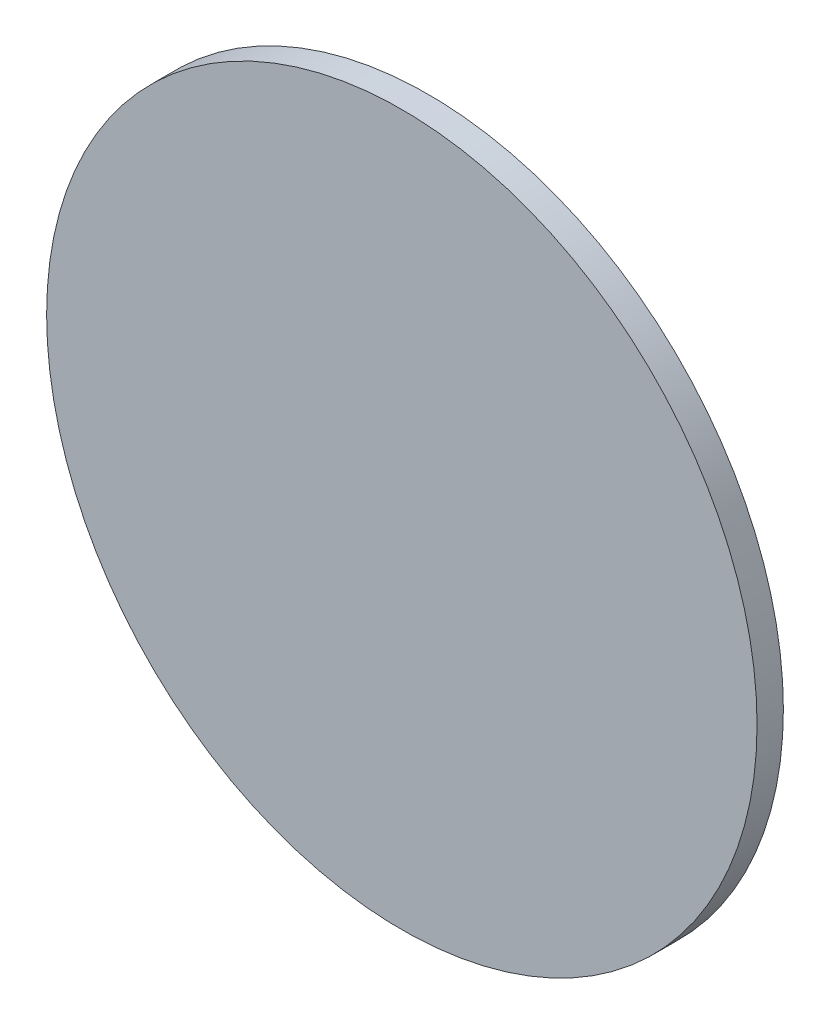
ISO-10303-21;
HEADER;
FILE_DESCRIPTION(('STEP AP214'),'2;1');
FILE_NAME('part.step','',(''),(''),'','','');
FILE_SCHEMA(('AUTOMOTIVE_DESIGN { 1 0 10303 214 1 1 1 1 }'));
ENDSEC;
DATA;
#1=APPLICATION_CONTEXT('core data for automotive mechanical design processes');
#2=APPLICATION_PROTOCOL_DEFINITION('international standard','automotive_design',2000,#1);
#3=PRODUCT_CONTEXT('',#1,'mechanical');
#4=PRODUCT('Part','Part','',(#3));
#5=PRODUCT_RELATED_PRODUCT_CATEGORY('part','',(#4));
#6=PRODUCT_DEFINITION_FORMATION('','',#4);
#7=PRODUCT_DEFINITION_CONTEXT('part definition',#1,'design');
#8=PRODUCT_DEFINITION('design','',#6,#7);
#9=PRODUCT_DEFINITION_SHAPE('','',#8);
#10=(LENGTH_UNIT() NAMED_UNIT(*) SI_UNIT(.MILLI.,.METRE.));
#11=(NAMED_UNIT(*) PLANE_ANGLE_UNIT() SI_UNIT($,.RADIAN.));
#12=(NAMED_UNIT(*) SI_UNIT($,.STERADIAN.) SOLID_ANGLE_UNIT());
#13=UNCERTAINTY_MEASURE_WITH_UNIT(LENGTH_MEASURE(1.E-05),#10,'distance_accuracy_value','');
#14=(GEOMETRIC_REPRESENTATION_CONTEXT(3) GLOBAL_UNCERTAINTY_ASSIGNED_CONTEXT((#13)) GLOBAL_UNIT_ASSIGNED_CONTEXT((#10,
#11,#12)) REPRESENTATION_CONTEXT('',''));
#15=CARTESIAN_POINT('',(0.,0.,0.));
#16=DIRECTION('',(0.,0.,1.));
#17=DIRECTION('',(1.,0.,0.));
#18=AXIS2_PLACEMENT_3D('',#15,#16,#17);
#19=CARTESIAN_POINT('',(0.,0.,1.));
#20=DIRECTION('',(0.,0.,-1.));
#21=DIRECTION('',(-1.,0.,0.));
#22=AXIS2_PLACEMENT_3D('',#19,#20,#21);
#23=CYLINDRICAL_SURFACE('',#22,13.5);
#24=CARTESIAN_POINT('',(0.,0.,1.));
#25=DIRECTION('',(0.,0.,1.));
#26=DIRECTION('',(1.,0.,0.));
#27=AXIS2_PLACEMENT_3D('',#24,#25,#26);
#28=CIRCLE('',#27,13.5);
#29=CARTESIAN_POINT('',(13.5,0.,1.));
#30=VERTEX_POINT('',#29);
#31=EDGE_CURVE('E10',#30,#30,#28,.T.);
#32=ORIENTED_EDGE('',*,*,#31,.F.);
#33=EDGE_LOOP('',(#32));
#34=FACE_BOUND('',#33,.T.);
#35=CARTESIAN_POINT('',(0.,0.,0.));
#36=DIRECTION('',(0.,0.,1.));
#37=DIRECTION('',(1.,0.,0.));
#38=AXIS2_PLACEMENT_3D('',#35,#36,#37);
#39=CIRCLE('',#38,13.5);
#40=CARTESIAN_POINT('',(13.5,0.,0.));
#41=VERTEX_POINT('',#40);
#42=EDGE_CURVE('E43',#41,#41,#39,.T.);
#43=ORIENTED_EDGE('',*,*,#42,.T.);
#44=EDGE_LOOP('',(#43));
#45=FACE_BOUND('',#44,.T.);
#46=ADVANCED_FACE('F40',(#34,#45),#23,.T.);
#47=CARTESIAN_POINT('',(0.,0.,1.));
#48=DIRECTION('',(0.,0.,1.));
#49=DIRECTION('',(1.,0.,0.));
#50=AXIS2_PLACEMENT_3D('',#47,#48,#49);
#51=PLANE('',#50);
#52=ORIENTED_EDGE('',*,*,#31,.T.);
#53=EDGE_LOOP('',(#52));
#54=FACE_BOUND('',#53,.T.);
#55=ADVANCED_FACE('F55',(#54),#51,.T.);
#56=CARTESIAN_POINT('',(0.,0.,0.));
#57=DIRECTION('',(0.,0.,1.));
#58=DIRECTION('',(1.,0.,0.));
#59=AXIS2_PLACEMENT_3D('',#56,#57,#58);
#60=PLANE('',#59);
#61=ORIENTED_EDGE('',*,*,#42,.F.);
#62=EDGE_LOOP('',(#61));
#63=FACE_BOUND('',#62,.T.);
#64=ADVANCED_FACE('F53',(#63),#60,.F.);
#65=CLOSED_SHELL('',(#46,#55,#64));
#66=MANIFOLD_SOLID_BREP('B2',#65);
#67=ADVANCED_BREP_SHAPE_REPRESENTATION('',(#18,#66),#14);
#68=SHAPE_DEFINITION_REPRESENTATION(#9,#67);
ENDSEC;
END-ISO-10303-21;
